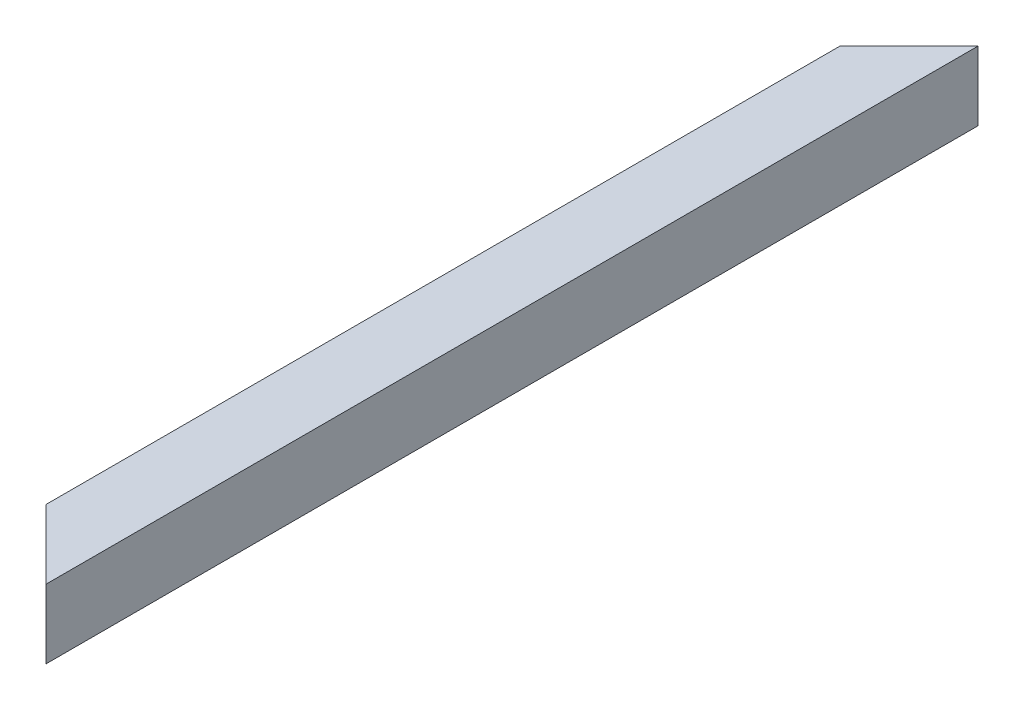
ISO-10303-21;
HEADER;
FILE_DESCRIPTION(('STEP AP214'),'2;1');
FILE_NAME('part.step','',(''),(''),'','','');
FILE_SCHEMA(('AUTOMOTIVE_DESIGN { 1 0 10303 214 1 1 1 1 }'));
ENDSEC;
DATA;
#1=APPLICATION_CONTEXT('core data for automotive mechanical design processes');
#2=APPLICATION_PROTOCOL_DEFINITION('international standard','automotive_design',2000,#1);
#3=PRODUCT_CONTEXT('',#1,'mechanical');
#4=PRODUCT('Part','Part','',(#3));
#5=PRODUCT_RELATED_PRODUCT_CATEGORY('part','',(#4));
#6=PRODUCT_DEFINITION_FORMATION('','',#4);
#7=PRODUCT_DEFINITION_CONTEXT('part definition',#1,'design');
#8=PRODUCT_DEFINITION('design','',#6,#7);
#9=PRODUCT_DEFINITION_SHAPE('','',#8);
#10=(LENGTH_UNIT() NAMED_UNIT(*) SI_UNIT(.MILLI.,.METRE.));
#11=(NAMED_UNIT(*) PLANE_ANGLE_UNIT() SI_UNIT($,.RADIAN.));
#12=(NAMED_UNIT(*) SI_UNIT($,.STERADIAN.) SOLID_ANGLE_UNIT());
#13=UNCERTAINTY_MEASURE_WITH_UNIT(LENGTH_MEASURE(1.E-05),#10,'distance_accuracy_value','');
#14=(GEOMETRIC_REPRESENTATION_CONTEXT(3) GLOBAL_UNCERTAINTY_ASSIGNED_CONTEXT((#13)) GLOBAL_UNIT_ASSIGNED_CONTEXT((#10,
#11,#12)) REPRESENTATION_CONTEXT('',''));
#15=CARTESIAN_POINT('',(0.,0.,0.));
#16=DIRECTION('',(0.,0.,1.));
#17=DIRECTION('',(1.,0.,0.));
#18=AXIS2_PLACEMENT_3D('',#15,#16,#17);
#19=CARTESIAN_POINT('',(140.,-10.,-450.));
#20=DIRECTION('',(0.,1.,0.));
#21=DIRECTION('',(0.,0.,1.));
#22=AXIS2_PLACEMENT_3D('',#19,#20,#21);
#23=PLANE('',#22);
#24=DIRECTION('',(-0.707106781186547,0.,0.707106781186548));
#25=VECTOR('',#24,1.);
#26=CARTESIAN_POINT('',(145.,-10.,-445.));
#27=LINE('',#26,#25);
#28=CARTESIAN_POINT('',(160.,-10.,-460.));
#29=VERTEX_POINT('',#28);
#30=CARTESIAN_POINT('',(140.,-10.,-440.));
#31=VERTEX_POINT('',#30);
#32=EDGE_CURVE('E166',#29,#31,#27,.T.);
#33=ORIENTED_EDGE('',*,*,#32,.F.);
#34=DIRECTION('',(0.,0.,1.));
#35=VECTOR('',#34,1.);
#36=CARTESIAN_POINT('',(160.,-10.,-450.));
#37=LINE('',#36,#35);
#38=CARTESIAN_POINT('',(160.,-10.,-190.));
#39=VERTEX_POINT('',#38);
#40=EDGE_CURVE('E53',#29,#39,#37,.T.);
#41=ORIENTED_EDGE('',*,*,#40,.T.);
#42=DIRECTION('',(0.707106781186548,0.,0.707106781186547));
#43=VECTOR('',#42,1.);
#44=CARTESIAN_POINT('',(19.9999999999998,-10.,-330.));
#45=LINE('',#44,#43);
#46=CARTESIAN_POINT('',(140.,-10.,-210.));
#47=VERTEX_POINT('',#46);
#48=EDGE_CURVE('E128',#47,#39,#45,.T.);
#49=ORIENTED_EDGE('',*,*,#48,.F.);
#50=DIRECTION('',(0.,0.,1.));
#51=VECTOR('',#50,1.);
#52=CARTESIAN_POINT('',(140.,-10.,-450.));
#53=LINE('',#52,#51);
#54=EDGE_CURVE('E132',#31,#47,#53,.T.);
#55=ORIENTED_EDGE('',*,*,#54,.F.);
#56=EDGE_LOOP('',(#33,#41,#49,#55));
#57=FACE_BOUND('',#56,.T.);
#58=ADVANCED_FACE('F39',(#57),#23,.F.);
#59=CARTESIAN_POINT('',(140.,-10.,-450.));
#60=DIRECTION('',(1.,0.,0.));
#61=DIRECTION('',(0.,0.,-1.));
#62=AXIS2_PLACEMENT_3D('',#59,#60,#61);
#63=PLANE('',#62);
#64=DIRECTION('',(0.,1.,0.));
#65=VECTOR('',#64,1.);
#66=CARTESIAN_POINT('',(140.,-10.,-440.));
#67=LINE('',#66,#65);
#68=CARTESIAN_POINT('',(140.,10.,-440.));
#69=VERTEX_POINT('',#68);
#70=EDGE_CURVE('E163',#31,#69,#67,.T.);
#71=ORIENTED_EDGE('',*,*,#70,.F.);
#72=ORIENTED_EDGE('',*,*,#54,.T.);
#73=DIRECTION('',(0.,-1.,0.));
#74=VECTOR('',#73,1.);
#75=CARTESIAN_POINT('',(140.,-10.,-210.));
#76=LINE('',#75,#74);
#77=CARTESIAN_POINT('',(140.,10.,-210.));
#78=VERTEX_POINT('',#77);
#79=EDGE_CURVE('E142',#78,#47,#76,.T.);
#80=ORIENTED_EDGE('',*,*,#79,.F.);
#81=DIRECTION('',(0.,0.,1.));
#82=VECTOR('',#81,1.);
#83=CARTESIAN_POINT('',(140.,10.,-450.));
#84=LINE('',#83,#82);
#85=EDGE_CURVE('E130',#69,#78,#84,.T.);
#86=ORIENTED_EDGE('',*,*,#85,.F.);
#87=EDGE_LOOP('',(#71,#72,#80,#86));
#88=FACE_BOUND('',#87,.T.);
#89=ADVANCED_FACE('F185',(#88),#63,.F.);
#90=CARTESIAN_POINT('',(140.,10.,-450.));
#91=DIRECTION('',(0.,-1.,0.));
#92=DIRECTION('',(0.,0.,-1.));
#93=AXIS2_PLACEMENT_3D('',#90,#91,#92);
#94=PLANE('',#93);
#95=DIRECTION('',(0.707106781186547,0.,-0.707106781186548));
#96=VECTOR('',#95,1.);
#97=CARTESIAN_POINT('',(145.,10.,-445.));
#98=LINE('',#97,#96);
#99=CARTESIAN_POINT('',(160.,10.,-460.));
#100=VERTEX_POINT('',#99);
#101=EDGE_CURVE('E160',#69,#100,#98,.T.);
#102=ORIENTED_EDGE('',*,*,#101,.F.);
#103=ORIENTED_EDGE('',*,*,#85,.T.);
#104=DIRECTION('',(-0.707106781186548,0.,-0.707106781186547));
#105=VECTOR('',#104,1.);
#106=CARTESIAN_POINT('',(19.9999999999998,10.,-330.));
#107=LINE('',#106,#105);
#108=CARTESIAN_POINT('',(160.,10.,-190.));
#109=VERTEX_POINT('',#108);
#110=EDGE_CURVE('E145',#109,#78,#107,.T.);
#111=ORIENTED_EDGE('',*,*,#110,.F.);
#112=DIRECTION('',(0.,0.,1.));
#113=VECTOR('',#112,1.);
#114=CARTESIAN_POINT('',(160.,10.,-450.));
#115=LINE('',#114,#113);
#116=EDGE_CURVE('E127',#100,#109,#115,.T.);
#117=ORIENTED_EDGE('',*,*,#116,.F.);
#118=EDGE_LOOP('',(#102,#103,#111,#117));
#119=FACE_BOUND('',#118,.T.);
#120=ADVANCED_FACE('F189',(#119),#94,.F.);
#121=CARTESIAN_POINT('',(160.,-10.,-450.));
#122=DIRECTION('',(-1.,0.,0.));
#123=DIRECTION('',(0.,0.,1.));
#124=AXIS2_PLACEMENT_3D('',#121,#122,#123);
#125=PLANE('',#124);
#126=DIRECTION('',(0.,-1.,0.));
#127=VECTOR('',#126,1.);
#128=CARTESIAN_POINT('',(160.,-10.,-460.));
#129=LINE('',#128,#127);
#130=EDGE_CURVE('E157',#100,#29,#129,.T.);
#131=ORIENTED_EDGE('',*,*,#130,.F.);
#132=ORIENTED_EDGE('',*,*,#116,.T.);
#133=DIRECTION('',(0.,1.,0.));
#134=VECTOR('',#133,1.);
#135=CARTESIAN_POINT('',(160.,-10.,-190.));
#136=LINE('',#135,#134);
#137=EDGE_CURVE('E148',#39,#109,#136,.T.);
#138=ORIENTED_EDGE('',*,*,#137,.F.);
#139=ORIENTED_EDGE('',*,*,#40,.F.);
#140=EDGE_LOOP('',(#131,#132,#138,#139));
#141=FACE_BOUND('',#140,.T.);
#142=ADVANCED_FACE('F181',(#141),#125,.F.);
#143=CARTESIAN_POINT('',(150.,0.,-200.));
#144=DIRECTION('',(-0.707106781186547,0.,0.707106781186548));
#145=DIRECTION('',(0.707106781186548,0.,0.707106781186547));
#146=AXIS2_PLACEMENT_3D('',#143,#144,#145);
#147=PLANE('',#146);
#148=DIRECTION('',(0.,1.,0.));
#149=VECTOR('',#148,1.);
#150=CARTESIAN_POINT('',(158.4,-8.40000000000002,-191.6));
#151=LINE('',#150,#149);
#152=CARTESIAN_POINT('',(158.4,-8.40000000000002,-191.6));
#153=VERTEX_POINT('',#152);
#154=CARTESIAN_POINT('',(158.4,8.39999999999999,-191.6));
#155=VERTEX_POINT('',#154);
#156=EDGE_CURVE('E119',#153,#155,#151,.T.);
#157=ORIENTED_EDGE('',*,*,#156,.F.);
#158=DIRECTION('',(0.707106781186548,0.,0.707106781186547));
#159=VECTOR('',#158,1.);
#160=CARTESIAN_POINT('',(20.7999999999998,-8.39999999999979,-329.2));
#161=LINE('',#160,#159);
#162=CARTESIAN_POINT('',(141.6,-8.39999999999999,-208.4));
#163=VERTEX_POINT('',#162);
#164=EDGE_CURVE('E46',#163,#153,#161,.T.);
#165=ORIENTED_EDGE('',*,*,#164,.F.);
#166=DIRECTION('',(0.,-1.,0.));
#167=VECTOR('',#166,1.);
#168=CARTESIAN_POINT('',(141.6,-8.39999999999999,-208.4));
#169=LINE('',#168,#167);
#170=CARTESIAN_POINT('',(141.6,8.39999999999999,-208.4));
#171=VERTEX_POINT('',#170);
#172=EDGE_CURVE('E154',#171,#163,#169,.T.);
#173=ORIENTED_EDGE('',*,*,#172,.F.);
#174=DIRECTION('',(-0.707106781186548,0.,-0.707106781186547));
#175=VECTOR('',#174,1.);
#176=CARTESIAN_POINT('',(20.7999999999998,8.39999999999999,-329.2));
#177=LINE('',#176,#175);
#178=EDGE_CURVE('E152',#155,#171,#177,.T.);
#179=ORIENTED_EDGE('',*,*,#178,.F.);
#180=EDGE_LOOP('',(#157,#165,#173,#179));
#181=FACE_BOUND('',#180,.T.);
#182=ORIENTED_EDGE('',*,*,#79,.T.);
#183=ORIENTED_EDGE('',*,*,#48,.T.);
#184=ORIENTED_EDGE('',*,*,#137,.T.);
#185=ORIENTED_EDGE('',*,*,#110,.T.);
#186=EDGE_LOOP('',(#182,#183,#184,#185));
#187=FACE_BOUND('',#186,.T.);
#188=ADVANCED_FACE('F178',(#181,#187),#147,.T.);
#189=CARTESIAN_POINT('',(158.4,-8.40000000000002,-450.));
#190=DIRECTION('',(-1.,0.,0.));
#191=DIRECTION('',(0.,0.,1.));
#192=AXIS2_PLACEMENT_3D('',#189,#190,#191);
#193=PLANE('',#192);
#194=DIRECTION('',(0.,0.,1.));
#195=VECTOR('',#194,1.);
#196=CARTESIAN_POINT('',(158.4,8.39999999999999,-450.));
#197=LINE('',#196,#195);
#198=CARTESIAN_POINT('',(158.4,8.39999999999999,-458.4));
#199=VERTEX_POINT('',#198);
#200=EDGE_CURVE('E110',#199,#155,#197,.T.);
#201=ORIENTED_EDGE('',*,*,#200,.F.);
#202=DIRECTION('',(0.,-1.,0.));
#203=VECTOR('',#202,1.);
#204=CARTESIAN_POINT('',(158.4,-8.40000000000002,-458.4));
#205=LINE('',#204,#203);
#206=CARTESIAN_POINT('',(158.4,-8.40000000000002,-458.4));
#207=VERTEX_POINT('',#206);
#208=EDGE_CURVE('E11',#199,#207,#205,.T.);
#209=ORIENTED_EDGE('',*,*,#208,.T.);
#210=DIRECTION('',(0.,0.,1.));
#211=VECTOR('',#210,1.);
#212=CARTESIAN_POINT('',(158.4,-8.40000000000002,-450.));
#213=LINE('',#212,#211);
#214=EDGE_CURVE('E133',#207,#153,#213,.T.);
#215=ORIENTED_EDGE('',*,*,#214,.T.);
#216=ORIENTED_EDGE('',*,*,#156,.T.);
#217=EDGE_LOOP('',(#201,#209,#215,#216));
#218=FACE_BOUND('',#217,.T.);
#219=ADVANCED_FACE('F117',(#218),#193,.T.);
#220=CARTESIAN_POINT('',(141.6,8.39999999999999,-450.));
#221=DIRECTION('',(0.,-1.,0.));
#222=DIRECTION('',(0.,0.,-1.));
#223=AXIS2_PLACEMENT_3D('',#220,#221,#222);
#224=PLANE('',#223);
#225=DIRECTION('',(0.,0.,1.));
#226=VECTOR('',#225,1.);
#227=CARTESIAN_POINT('',(141.6,8.39999999999999,-450.));
#228=LINE('',#227,#226);
#229=CARTESIAN_POINT('',(141.6,8.39999999999999,-441.6));
#230=VERTEX_POINT('',#229);
#231=EDGE_CURVE('E112',#230,#171,#228,.T.);
#232=ORIENTED_EDGE('',*,*,#231,.F.);
#233=DIRECTION('',(0.707106781186547,0.,-0.707106781186548));
#234=VECTOR('',#233,1.);
#235=CARTESIAN_POINT('',(145.8,8.39999999999999,-445.8));
#236=LINE('',#235,#234);
#237=EDGE_CURVE('E103',#230,#199,#236,.T.);
#238=ORIENTED_EDGE('',*,*,#237,.T.);
#239=ORIENTED_EDGE('',*,*,#200,.T.);
#240=ORIENTED_EDGE('',*,*,#178,.T.);
#241=EDGE_LOOP('',(#232,#238,#239,#240));
#242=FACE_BOUND('',#241,.T.);
#243=ADVANCED_FACE('F108',(#242),#224,.T.);
#244=CARTESIAN_POINT('',(141.6,-8.39999999999999,-450.));
#245=DIRECTION('',(1.,0.,0.));
#246=DIRECTION('',(0.,0.,-1.));
#247=AXIS2_PLACEMENT_3D('',#244,#245,#246);
#248=PLANE('',#247);
#249=DIRECTION('',(0.,0.,1.));
#250=VECTOR('',#249,1.);
#251=CARTESIAN_POINT('',(141.6,-8.39999999999999,-450.));
#252=LINE('',#251,#250);
#253=CARTESIAN_POINT('',(141.6,-8.39999999999999,-441.6));
#254=VERTEX_POINT('',#253);
#255=EDGE_CURVE('E122',#254,#163,#252,.T.);
#256=ORIENTED_EDGE('',*,*,#255,.F.);
#257=DIRECTION('',(0.,1.,0.));
#258=VECTOR('',#257,1.);
#259=CARTESIAN_POINT('',(141.6,-8.39999999999999,-441.6));
#260=LINE('',#259,#258);
#261=EDGE_CURVE('E114',#254,#230,#260,.T.);
#262=ORIENTED_EDGE('',*,*,#261,.T.);
#263=ORIENTED_EDGE('',*,*,#231,.T.);
#264=ORIENTED_EDGE('',*,*,#172,.T.);
#265=EDGE_LOOP('',(#256,#262,#263,#264));
#266=FACE_BOUND('',#265,.T.);
#267=ADVANCED_FACE('F172',(#266),#248,.T.);
#268=CARTESIAN_POINT('',(141.6,-8.39999999999999,-450.));
#269=DIRECTION('',(0.,1.,0.));
#270=DIRECTION('',(-1.,0.,0.));
#271=AXIS2_PLACEMENT_3D('',#268,#269,#270);
#272=PLANE('',#271);
#273=ORIENTED_EDGE('',*,*,#214,.F.);
#274=DIRECTION('',(-0.707106781186547,0.,0.707106781186548));
#275=VECTOR('',#274,1.);
#276=CARTESIAN_POINT('',(145.8,-8.4,-445.8));
#277=LINE('',#276,#275);
#278=EDGE_CURVE('E61',#207,#254,#277,.T.);
#279=ORIENTED_EDGE('',*,*,#278,.T.);
#280=ORIENTED_EDGE('',*,*,#255,.T.);
#281=ORIENTED_EDGE('',*,*,#164,.T.);
#282=EDGE_LOOP('',(#273,#279,#280,#281));
#283=FACE_BOUND('',#282,.T.);
#284=ADVANCED_FACE('F176',(#283),#272,.T.);
#285=CARTESIAN_POINT('',(150.,0.,-450.));
#286=DIRECTION('',(-0.707106781186548,0.,-0.707106781186547));
#287=DIRECTION('',(-0.707106781186547,0.,0.707106781186548));
#288=AXIS2_PLACEMENT_3D('',#285,#286,#287);
#289=PLANE('',#288);
#290=ORIENTED_EDGE('',*,*,#278,.F.);
#291=ORIENTED_EDGE('',*,*,#208,.F.);
#292=ORIENTED_EDGE('',*,*,#237,.F.);
#293=ORIENTED_EDGE('',*,*,#261,.F.);
#294=EDGE_LOOP('',(#290,#291,#292,#293));
#295=FACE_BOUND('',#294,.T.);
#296=ORIENTED_EDGE('',*,*,#101,.T.);
#297=ORIENTED_EDGE('',*,*,#130,.T.);
#298=ORIENTED_EDGE('',*,*,#32,.T.);
#299=ORIENTED_EDGE('',*,*,#70,.T.);
#300=EDGE_LOOP('',(#296,#297,#298,#299));
#301=FACE_BOUND('',#300,.T.);
#302=ADVANCED_FACE('F101',(#295,#301),#289,.T.);
#303=CLOSED_SHELL('',(#58,#89,#120,#142,#188,#219,#243,#267,#284,#302));
#304=MANIFOLD_SOLID_BREP('B2',#303);
#305=ADVANCED_BREP_SHAPE_REPRESENTATION('',(#18,#304),#14);
#306=SHAPE_DEFINITION_REPRESENTATION(#9,#305);
ENDSEC;
END-ISO-10303-21;
